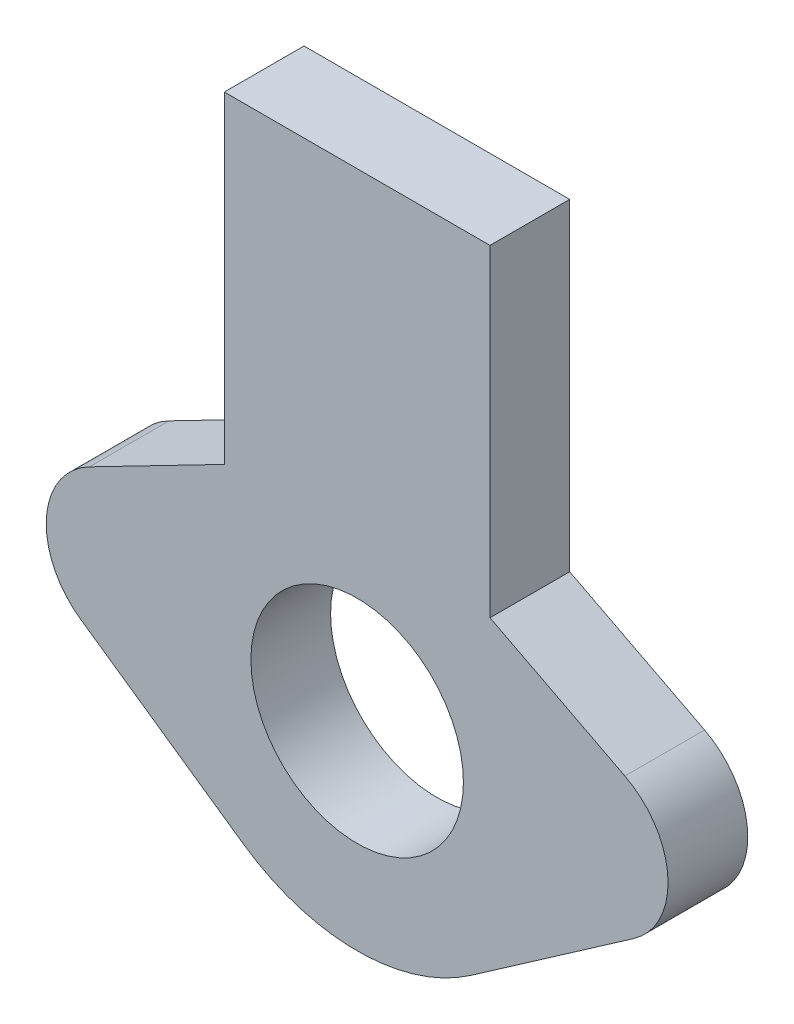
ISO-10303-21;
HEADER;
FILE_DESCRIPTION(('STEP AP214'),'2;1');
FILE_NAME('part.step','',(''),(''),'','','');
FILE_SCHEMA(('AUTOMOTIVE_DESIGN { 1 0 10303 214 1 1 1 1 }'));
ENDSEC;
DATA;
#1=APPLICATION_CONTEXT('core data for automotive mechanical design processes');
#2=APPLICATION_PROTOCOL_DEFINITION('international standard','automotive_design',2000,#1);
#3=PRODUCT_CONTEXT('',#1,'mechanical');
#4=PRODUCT('Part','Part','',(#3));
#5=PRODUCT_RELATED_PRODUCT_CATEGORY('part','',(#4));
#6=PRODUCT_DEFINITION_FORMATION('','',#4);
#7=PRODUCT_DEFINITION_CONTEXT('part definition',#1,'design');
#8=PRODUCT_DEFINITION('design','',#6,#7);
#9=PRODUCT_DEFINITION_SHAPE('','',#8);
#10=(LENGTH_UNIT() NAMED_UNIT(*) SI_UNIT(.MILLI.,.METRE.));
#11=(NAMED_UNIT(*) PLANE_ANGLE_UNIT() SI_UNIT($,.RADIAN.));
#12=(NAMED_UNIT(*) SI_UNIT($,.STERADIAN.) SOLID_ANGLE_UNIT());
#13=UNCERTAINTY_MEASURE_WITH_UNIT(LENGTH_MEASURE(1.E-05),#10,'distance_accuracy_value','');
#14=(GEOMETRIC_REPRESENTATION_CONTEXT(3) GLOBAL_UNCERTAINTY_ASSIGNED_CONTEXT((#13)) GLOBAL_UNIT_ASSIGNED_CONTEXT((#10,
#11,#12)) REPRESENTATION_CONTEXT('',''));
#15=CARTESIAN_POINT('',(0.,0.,0.));
#16=DIRECTION('',(0.,0.,1.));
#17=DIRECTION('',(1.,0.,0.));
#18=AXIS2_PLACEMENT_3D('',#15,#16,#17);
#19=CARTESIAN_POINT('',(0.,0.,3.));
#20=DIRECTION('',(0.,0.,-1.));
#21=DIRECTION('',(-1.,0.,0.));
#22=AXIS2_PLACEMENT_3D('',#19,#20,#21);
#23=CYLINDRICAL_SURFACE('',#22,7.5);
#24=CARTESIAN_POINT('',(0.,0.,3.));
#25=DIRECTION('',(0.,0.,1.));
#26=DIRECTION('',(1.,0.,0.));
#27=AXIS2_PLACEMENT_3D('',#24,#25,#26);
#28=CIRCLE('',#27,7.5);
#29=CARTESIAN_POINT('',(-4.28365315715204,-6.15632322325765,3.));
#30=VERTEX_POINT('',#29);
#31=CARTESIAN_POINT('',(4.28365315715204,-6.15632322325765,3.));
#32=VERTEX_POINT('',#31);
#33=EDGE_CURVE('E131',#30,#32,#28,.T.);
#34=ORIENTED_EDGE('',*,*,#33,.F.);
#35=DIRECTION('',(0.,0.,-1.));
#36=VECTOR('',#35,1.);
#37=CARTESIAN_POINT('',(-4.28365315715204,-6.15632322325765,19.9388499049898));
#38=LINE('',#37,#36);
#39=CARTESIAN_POINT('',(-4.28365315715204,-6.15632322325765,0.));
#40=VERTEX_POINT('',#39);
#41=EDGE_CURVE('E117',#30,#40,#38,.T.);
#42=ORIENTED_EDGE('',*,*,#41,.T.);
#43=CARTESIAN_POINT('',(0.,0.,0.));
#44=DIRECTION('',(0.,0.,1.));
#45=DIRECTION('',(1.,0.,0.));
#46=AXIS2_PLACEMENT_3D('',#43,#44,#45);
#47=CIRCLE('',#46,7.5);
#48=CARTESIAN_POINT('',(4.28365315715204,-6.15632322325765,0.));
#49=VERTEX_POINT('',#48);
#50=EDGE_CURVE('E128',#40,#49,#47,.T.);
#51=ORIENTED_EDGE('',*,*,#50,.T.);
#52=DIRECTION('',(0.,0.,-1.));
#53=VECTOR('',#52,1.);
#54=CARTESIAN_POINT('',(4.28365315715204,-6.15632322325765,19.9388499049898));
#55=LINE('',#54,#53);
#56=EDGE_CURVE('E190',#32,#49,#55,.T.);
#57=ORIENTED_EDGE('',*,*,#56,.F.);
#58=EDGE_LOOP('',(#34,#42,#51,#57));
#59=FACE_BOUND('',#58,.T.);
#60=ADVANCED_FACE('F35',(#59),#23,.T.);
#61=CARTESIAN_POINT('',(0.,0.,3.));
#62=DIRECTION('',(0.,0.,1.));
#63=DIRECTION('',(1.,0.,0.));
#64=AXIS2_PLACEMENT_3D('',#61,#62,#63);
#65=PLANE('',#64);
#66=DIRECTION('',(0.888760335053028,0.458372192477281,0.));
#67=VECTOR('',#66,1.);
#68=CARTESIAN_POINT('',(-14.5066799209808,0.956997387831392,3.));
#69=LINE('',#68,#67);
#70=CARTESIAN_POINT('',(-10.0791245300203,3.24047943785792,3.));
#71=VERTEX_POINT('',#70);
#72=CARTESIAN_POINT('',(-5.,5.86000390904355,3.));
#73=VERTEX_POINT('',#72);
#74=EDGE_CURVE('E133',#71,#73,#69,.T.);
#75=ORIENTED_EDGE('',*,*,#74,.F.);
#76=CARTESIAN_POINT('',(-8.70400795258846,0.574198432698835,3.));
#77=DIRECTION('',(0.,0.,1.));
#78=DIRECTION('',(1.,0.,0.));
#79=AXIS2_PLACEMENT_3D('',#76,#77,#78);
#80=CIRCLE('',#79,3.);
#81=CARTESIAN_POINT('',(-10.4174692154493,-1.88833085660422,3.));
#82=VERTEX_POINT('',#81);
#83=EDGE_CURVE('E174',#71,#82,#80,.T.);
#84=ORIENTED_EDGE('',*,*,#83,.T.);
#85=DIRECTION('',(-0.820843096434352,0.571153754286938,0.));
#86=VECTOR('',#85,1.);
#87=CARTESIAN_POINT('',(-4.28365315715204,-6.15632322325765,3.));
#88=LINE('',#87,#86);
#89=EDGE_CURVE('E213',#30,#82,#88,.T.);
#90=ORIENTED_EDGE('',*,*,#89,.F.);
#91=ORIENTED_EDGE('',*,*,#33,.T.);
#92=DIRECTION('',(-0.820843096434352,-0.571153754286938,0.));
#93=VECTOR('',#92,1.);
#94=CARTESIAN_POINT('',(4.28365315715204,-6.15632322325765,3.));
#95=LINE('',#94,#93);
#96=CARTESIAN_POINT('',(10.4174692154493,-1.88833085660422,3.));
#97=VERTEX_POINT('',#96);
#98=EDGE_CURVE('E188',#97,#32,#95,.T.);
#99=ORIENTED_EDGE('',*,*,#98,.F.);
#100=CARTESIAN_POINT('',(8.70400795258846,0.574198432698836,3.));
#101=DIRECTION('',(0.,0.,1.));
#102=DIRECTION('',(1.,0.,0.));
#103=AXIS2_PLACEMENT_3D('',#100,#101,#102);
#104=CIRCLE('',#103,3.);
#105=CARTESIAN_POINT('',(10.0791245300203,3.24047943785792,3.));
#106=VERTEX_POINT('',#105);
#107=EDGE_CURVE('E50',#97,#106,#104,.T.);
#108=ORIENTED_EDGE('',*,*,#107,.T.);
#109=DIRECTION('',(0.888760335053028,-0.458372192477281,0.));
#110=VECTOR('',#109,1.);
#111=CARTESIAN_POINT('',(14.5066799209808,0.956997387831392,3.));
#112=LINE('',#111,#110);
#113=CARTESIAN_POINT('',(5.,5.86000390904355,3.));
#114=VERTEX_POINT('',#113);
#115=EDGE_CURVE('E180',#114,#106,#112,.T.);
#116=ORIENTED_EDGE('',*,*,#115,.F.);
#117=DIRECTION('',(0.,1.,0.));
#118=VECTOR('',#117,1.);
#119=CARTESIAN_POINT('',(5.,5.59016994374947,3.));
#120=LINE('',#119,#118);
#121=CARTESIAN_POINT('',(5.,18.,3.));
#122=VERTEX_POINT('',#121);
#123=EDGE_CURVE('E195',#114,#122,#120,.T.);
#124=ORIENTED_EDGE('',*,*,#123,.T.);
#125=DIRECTION('',(-1.,0.,0.));
#126=VECTOR('',#125,1.);
#127=CARTESIAN_POINT('',(-5.,18.,3.));
#128=LINE('',#127,#126);
#129=CARTESIAN_POINT('',(-5.,18.,3.));
#130=VERTEX_POINT('',#129);
#131=EDGE_CURVE('E196',#122,#130,#128,.T.);
#132=ORIENTED_EDGE('',*,*,#131,.T.);
#133=DIRECTION('',(0.,-1.,0.));
#134=VECTOR('',#133,1.);
#135=CARTESIAN_POINT('',(-5.,5.59016994374947,3.));
#136=LINE('',#135,#134);
#137=EDGE_CURVE('E147',#130,#73,#136,.T.);
#138=ORIENTED_EDGE('',*,*,#137,.T.);
#139=EDGE_LOOP('',(#75,#84,#90,#91,#99,#108,#116,#124,#132,#138));
#140=FACE_BOUND('',#139,.T.);
#141=CARTESIAN_POINT('',(0.,0.,3.));
#142=DIRECTION('',(0.,0.,1.));
#143=DIRECTION('',(1.,0.,0.));
#144=AXIS2_PLACEMENT_3D('',#141,#142,#143);
#145=CIRCLE('',#144,4.);
#146=CARTESIAN_POINT('',(4.,0.,3.));
#147=VERTEX_POINT('',#146);
#148=EDGE_CURVE('E139',#147,#147,#145,.T.);
#149=ORIENTED_EDGE('',*,*,#148,.F.);
#150=EDGE_LOOP('',(#149));
#151=FACE_BOUND('',#150,.T.);
#152=ADVANCED_FACE('F202',(#140,#151),#65,.T.);
#153=CARTESIAN_POINT('',(0.,0.,0.));
#154=DIRECTION('',(0.,0.,1.));
#155=DIRECTION('',(1.,0.,0.));
#156=AXIS2_PLACEMENT_3D('',#153,#154,#155);
#157=PLANE('',#156);
#158=DIRECTION('',(-0.820843096434353,0.571153754286938,0.));
#159=VECTOR('',#158,1.);
#160=CARTESIAN_POINT('',(-4.28365315715204,-6.15632322325765,0.));
#161=LINE('',#160,#159);
#162=CARTESIAN_POINT('',(-10.4174692154493,-1.88833085660422,0.));
#163=VERTEX_POINT('',#162);
#164=EDGE_CURVE('E113',#40,#163,#161,.T.);
#165=ORIENTED_EDGE('',*,*,#164,.T.);
#166=CARTESIAN_POINT('',(-8.70400795258846,0.574198432698835,0.));
#167=DIRECTION('',(0.,0.,1.));
#168=DIRECTION('',(1.,0.,0.));
#169=AXIS2_PLACEMENT_3D('',#166,#167,#168);
#170=CIRCLE('',#169,3.);
#171=CARTESIAN_POINT('',(-10.0791245300203,3.24047943785792,0.));
#172=VERTEX_POINT('',#171);
#173=EDGE_CURVE('E169',#163,#172,#170,.F.);
#174=ORIENTED_EDGE('',*,*,#173,.T.);
#175=DIRECTION('',(0.888760335053028,0.458372192477281,0.));
#176=VECTOR('',#175,1.);
#177=CARTESIAN_POINT('',(-14.5066799209808,0.956997387831392,0.));
#178=LINE('',#177,#176);
#179=CARTESIAN_POINT('',(-5.,5.86000390904355,0.));
#180=VERTEX_POINT('',#179);
#181=EDGE_CURVE('E123',#172,#180,#178,.T.);
#182=ORIENTED_EDGE('',*,*,#181,.T.);
#183=DIRECTION('',(0.,-1.,0.));
#184=VECTOR('',#183,1.);
#185=CARTESIAN_POINT('',(-5.,5.59016994374947,0.));
#186=LINE('',#185,#184);
#187=CARTESIAN_POINT('',(-5.,18.,0.));
#188=VERTEX_POINT('',#187);
#189=EDGE_CURVE('E151',#188,#180,#186,.T.);
#190=ORIENTED_EDGE('',*,*,#189,.F.);
#191=DIRECTION('',(-1.,0.,0.));
#192=VECTOR('',#191,1.);
#193=CARTESIAN_POINT('',(-5.,18.,0.));
#194=LINE('',#193,#192);
#195=CARTESIAN_POINT('',(5.,18.,0.));
#196=VERTEX_POINT('',#195);
#197=EDGE_CURVE('E141',#196,#188,#194,.T.);
#198=ORIENTED_EDGE('',*,*,#197,.F.);
#199=DIRECTION('',(0.,1.,0.));
#200=VECTOR('',#199,1.);
#201=CARTESIAN_POINT('',(5.,5.59016994374947,0.));
#202=LINE('',#201,#200);
#203=CARTESIAN_POINT('',(5.,5.86000390904355,0.));
#204=VERTEX_POINT('',#203);
#205=EDGE_CURVE('E138',#204,#196,#202,.T.);
#206=ORIENTED_EDGE('',*,*,#205,.F.);
#207=DIRECTION('',(0.888760335053028,-0.458372192477281,0.));
#208=VECTOR('',#207,1.);
#209=CARTESIAN_POINT('',(14.5066799209808,0.956997387831392,0.));
#210=LINE('',#209,#208);
#211=CARTESIAN_POINT('',(10.0791245300203,3.24047943785792,0.));
#212=VERTEX_POINT('',#211);
#213=EDGE_CURVE('E132',#204,#212,#210,.T.);
#214=ORIENTED_EDGE('',*,*,#213,.T.);
#215=CARTESIAN_POINT('',(8.70400795258846,0.574198432698836,0.));
#216=DIRECTION('',(0.,0.,1.));
#217=DIRECTION('',(1.,0.,0.));
#218=AXIS2_PLACEMENT_3D('',#215,#216,#217);
#219=CIRCLE('',#218,3.);
#220=CARTESIAN_POINT('',(10.4174692154493,-1.88833085660422,0.));
#221=VERTEX_POINT('',#220);
#222=EDGE_CURVE('E167',#212,#221,#219,.F.);
#223=ORIENTED_EDGE('',*,*,#222,.T.);
#224=DIRECTION('',(-0.820843096434353,-0.571153754286938,0.));
#225=VECTOR('',#224,1.);
#226=CARTESIAN_POINT('',(4.28365315715204,-6.15632322325765,0.));
#227=LINE('',#226,#225);
#228=EDGE_CURVE('E137',#221,#49,#227,.T.);
#229=ORIENTED_EDGE('',*,*,#228,.T.);
#230=ORIENTED_EDGE('',*,*,#50,.F.);
#231=EDGE_LOOP('',(#165,#174,#182,#190,#198,#206,#214,#223,#229,#230));
#232=FACE_BOUND('',#231,.T.);
#233=CARTESIAN_POINT('',(0.,0.,0.));
#234=DIRECTION('',(0.,0.,1.));
#235=DIRECTION('',(1.,0.,0.));
#236=AXIS2_PLACEMENT_3D('',#233,#234,#235);
#237=CIRCLE('',#236,4.);
#238=CARTESIAN_POINT('',(4.,0.,0.));
#239=VERTEX_POINT('',#238);
#240=EDGE_CURVE('E144',#239,#239,#237,.T.);
#241=ORIENTED_EDGE('',*,*,#240,.T.);
#242=EDGE_LOOP('',(#241));
#243=FACE_BOUND('',#242,.T.);
#244=ADVANCED_FACE('F135',(#232,#243),#157,.F.);
#245=CARTESIAN_POINT('',(5.,5.59016994374947,3.));
#246=DIRECTION('',(-1.,0.,0.));
#247=DIRECTION('',(0.,-1.,0.));
#248=AXIS2_PLACEMENT_3D('',#245,#246,#247);
#249=PLANE('',#248);
#250=ORIENTED_EDGE('',*,*,#123,.F.);
#251=DIRECTION('',(0.,0.,-1.));
#252=VECTOR('',#251,1.);
#253=CARTESIAN_POINT('',(5.,5.86000390904355,3.));
#254=LINE('',#253,#252);
#255=EDGE_CURVE('E160',#114,#204,#254,.T.);
#256=ORIENTED_EDGE('',*,*,#255,.T.);
#257=ORIENTED_EDGE('',*,*,#205,.T.);
#258=DIRECTION('',(0.,0.,-1.));
#259=VECTOR('',#258,1.);
#260=CARTESIAN_POINT('',(5.,18.,3.));
#261=LINE('',#260,#259);
#262=EDGE_CURVE('E157',#122,#196,#261,.T.);
#263=ORIENTED_EDGE('',*,*,#262,.F.);
#264=EDGE_LOOP('',(#250,#256,#257,#263));
#265=FACE_BOUND('',#264,.T.);
#266=ADVANCED_FACE('F231',(#265),#249,.F.);
#267=CARTESIAN_POINT('',(-5.,18.,3.));
#268=DIRECTION('',(0.,-1.,0.));
#269=DIRECTION('',(0.,0.,-1.));
#270=AXIS2_PLACEMENT_3D('',#267,#268,#269);
#271=PLANE('',#270);
#272=ORIENTED_EDGE('',*,*,#197,.T.);
#273=DIRECTION('',(0.,0.,-1.));
#274=VECTOR('',#273,1.);
#275=CARTESIAN_POINT('',(-5.,18.,3.));
#276=LINE('',#275,#274);
#277=EDGE_CURVE('E154',#130,#188,#276,.T.);
#278=ORIENTED_EDGE('',*,*,#277,.F.);
#279=ORIENTED_EDGE('',*,*,#131,.F.);
#280=ORIENTED_EDGE('',*,*,#262,.T.);
#281=EDGE_LOOP('',(#272,#278,#279,#280));
#282=FACE_BOUND('',#281,.T.);
#283=ADVANCED_FACE('F234',(#282),#271,.F.);
#284=CARTESIAN_POINT('',(-5.,5.59016994374947,3.));
#285=DIRECTION('',(1.,0.,0.));
#286=DIRECTION('',(0.,1.,0.));
#287=AXIS2_PLACEMENT_3D('',#284,#285,#286);
#288=PLANE('',#287);
#289=ORIENTED_EDGE('',*,*,#189,.T.);
#290=DIRECTION('',(0.,0.,1.));
#291=VECTOR('',#290,1.);
#292=CARTESIAN_POINT('',(-5.,5.86000390904355,3.));
#293=LINE('',#292,#291);
#294=EDGE_CURVE('E163',#180,#73,#293,.T.);
#295=ORIENTED_EDGE('',*,*,#294,.T.);
#296=ORIENTED_EDGE('',*,*,#137,.F.);
#297=ORIENTED_EDGE('',*,*,#277,.T.);
#298=EDGE_LOOP('',(#289,#295,#296,#297));
#299=FACE_BOUND('',#298,.T.);
#300=ADVANCED_FACE('F206',(#299),#288,.F.);
#301=CARTESIAN_POINT('',(0.,0.,3.));
#302=DIRECTION('',(0.,0.,-1.));
#303=DIRECTION('',(-1.,0.,0.));
#304=AXIS2_PLACEMENT_3D('',#301,#302,#303);
#305=CYLINDRICAL_SURFACE('',#304,4.);
#306=ORIENTED_EDGE('',*,*,#148,.T.);
#307=EDGE_LOOP('',(#306));
#308=FACE_BOUND('',#307,.T.);
#309=ORIENTED_EDGE('',*,*,#240,.F.);
#310=EDGE_LOOP('',(#309));
#311=FACE_BOUND('',#310,.T.);
#312=ADVANCED_FACE('F241',(#308,#311),#305,.F.);
#313=CARTESIAN_POINT('',(14.5066799209808,0.956997387831392,19.9388499049898));
#314=DIRECTION('',(0.458372192477281,0.888760335053028,0.));
#315=DIRECTION('',(-0.888760335053028,0.458372192477281,0.));
#316=AXIS2_PLACEMENT_3D('',#313,#314,#315);
#317=PLANE('',#316);
#318=ORIENTED_EDGE('',*,*,#115,.T.);
#319=DIRECTION('',(0.,0.,-1.));
#320=VECTOR('',#319,1.);
#321=CARTESIAN_POINT('',(10.0791245300203,3.24047943785792,19.9388499049898));
#322=LINE('',#321,#320);
#323=EDGE_CURVE('E43',#106,#212,#322,.T.);
#324=ORIENTED_EDGE('',*,*,#323,.T.);
#325=ORIENTED_EDGE('',*,*,#213,.F.);
#326=ORIENTED_EDGE('',*,*,#255,.F.);
#327=EDGE_LOOP('',(#318,#324,#325,#326));
#328=FACE_BOUND('',#327,.T.);
#329=ADVANCED_FACE('F179',(#328),#317,.T.);
#330=CARTESIAN_POINT('',(4.28365315715204,-6.15632322325765,19.9388499049898));
#331=DIRECTION('',(0.571153754286938,-0.820843096434352,0.));
#332=DIRECTION('',(0.820843096434352,0.571153754286938,0.));
#333=AXIS2_PLACEMENT_3D('',#330,#331,#332);
#334=PLANE('',#333);
#335=ORIENTED_EDGE('',*,*,#228,.F.);
#336=DIRECTION('',(0.,0.,-1.));
#337=VECTOR('',#336,1.);
#338=CARTESIAN_POINT('',(10.4174692154493,-1.88833085660422,19.9388499049898));
#339=LINE('',#338,#337);
#340=EDGE_CURVE('E11',#221,#97,#339,.F.);
#341=ORIENTED_EDGE('',*,*,#340,.T.);
#342=ORIENTED_EDGE('',*,*,#98,.T.);
#343=ORIENTED_EDGE('',*,*,#56,.T.);
#344=EDGE_LOOP('',(#335,#341,#342,#343));
#345=FACE_BOUND('',#344,.T.);
#346=ADVANCED_FACE('F219',(#345),#334,.T.);
#347=CARTESIAN_POINT('',(-14.5066799209808,0.956997387831392,19.9388499049898));
#348=DIRECTION('',(-0.458372192477281,0.888760335053028,0.));
#349=DIRECTION('',(-0.888760335053028,-0.458372192477281,0.));
#350=AXIS2_PLACEMENT_3D('',#347,#348,#349);
#351=PLANE('',#350);
#352=ORIENTED_EDGE('',*,*,#181,.F.);
#353=DIRECTION('',(0.,0.,-1.));
#354=VECTOR('',#353,1.);
#355=CARTESIAN_POINT('',(-10.0791245300203,3.24047943785792,19.9388499049898));
#356=LINE('',#355,#354);
#357=EDGE_CURVE('E171',#172,#71,#356,.F.);
#358=ORIENTED_EDGE('',*,*,#357,.T.);
#359=ORIENTED_EDGE('',*,*,#74,.T.);
#360=ORIENTED_EDGE('',*,*,#294,.F.);
#361=EDGE_LOOP('',(#352,#358,#359,#360));
#362=FACE_BOUND('',#361,.T.);
#363=ADVANCED_FACE('F211',(#362),#351,.T.);
#364=CARTESIAN_POINT('',(-4.28365315715204,-6.15632322325765,19.9388499049898));
#365=DIRECTION('',(-0.571153754286938,-0.820843096434352,0.));
#366=DIRECTION('',(0.820843096434352,-0.571153754286938,0.));
#367=AXIS2_PLACEMENT_3D('',#364,#365,#366);
#368=PLANE('',#367);
#369=ORIENTED_EDGE('',*,*,#89,.T.);
#370=DIRECTION('',(0.,0.,-1.));
#371=VECTOR('',#370,1.);
#372=CARTESIAN_POINT('',(-10.4174692154493,-1.88833085660422,19.9388499049898));
#373=LINE('',#372,#371);
#374=EDGE_CURVE('E120',#82,#163,#373,.T.);
#375=ORIENTED_EDGE('',*,*,#374,.T.);
#376=ORIENTED_EDGE('',*,*,#164,.F.);
#377=ORIENTED_EDGE('',*,*,#41,.F.);
#378=EDGE_LOOP('',(#369,#375,#376,#377));
#379=FACE_BOUND('',#378,.T.);
#380=ADVANCED_FACE('F116',(#379),#368,.T.);
#381=CARTESIAN_POINT('',(-8.70400795258846,0.574198432698835,19.9388499049898));
#382=DIRECTION('',(0.,0.,-1.));
#383=DIRECTION('',(-1.,0.,0.));
#384=AXIS2_PLACEMENT_3D('',#381,#382,#383);
#385=CYLINDRICAL_SURFACE('',#384,3.);
#386=ORIENTED_EDGE('',*,*,#83,.F.);
#387=ORIENTED_EDGE('',*,*,#357,.F.);
#388=ORIENTED_EDGE('',*,*,#173,.F.);
#389=ORIENTED_EDGE('',*,*,#374,.F.);
#390=EDGE_LOOP('',(#386,#387,#388,#389));
#391=FACE_BOUND('',#390,.T.);
#392=ADVANCED_FACE('F218',(#391),#385,.T.);
#393=CARTESIAN_POINT('',(8.70400795258846,0.574198432698836,19.9388499049898));
#394=DIRECTION('',(0.,0.,-1.));
#395=DIRECTION('',(-1.,0.,0.));
#396=AXIS2_PLACEMENT_3D('',#393,#394,#395);
#397=CYLINDRICAL_SURFACE('',#396,3.);
#398=ORIENTED_EDGE('',*,*,#107,.F.);
#399=ORIENTED_EDGE('',*,*,#340,.F.);
#400=ORIENTED_EDGE('',*,*,#222,.F.);
#401=ORIENTED_EDGE('',*,*,#323,.F.);
#402=EDGE_LOOP('',(#398,#399,#400,#401));
#403=FACE_BOUND('',#402,.T.);
#404=ADVANCED_FACE('F37',(#403),#397,.T.);
#405=CLOSED_SHELL('',(#60,#152,#244,#266,#283,#300,#312,#329,#346,#363,#380,#392,#404));
#406=MANIFOLD_SOLID_BREP('B2',#405);
#407=ADVANCED_BREP_SHAPE_REPRESENTATION('',(#18,#406),#14);
#408=SHAPE_DEFINITION_REPRESENTATION(#9,#407);
ENDSEC;
END-ISO-10303-21;
